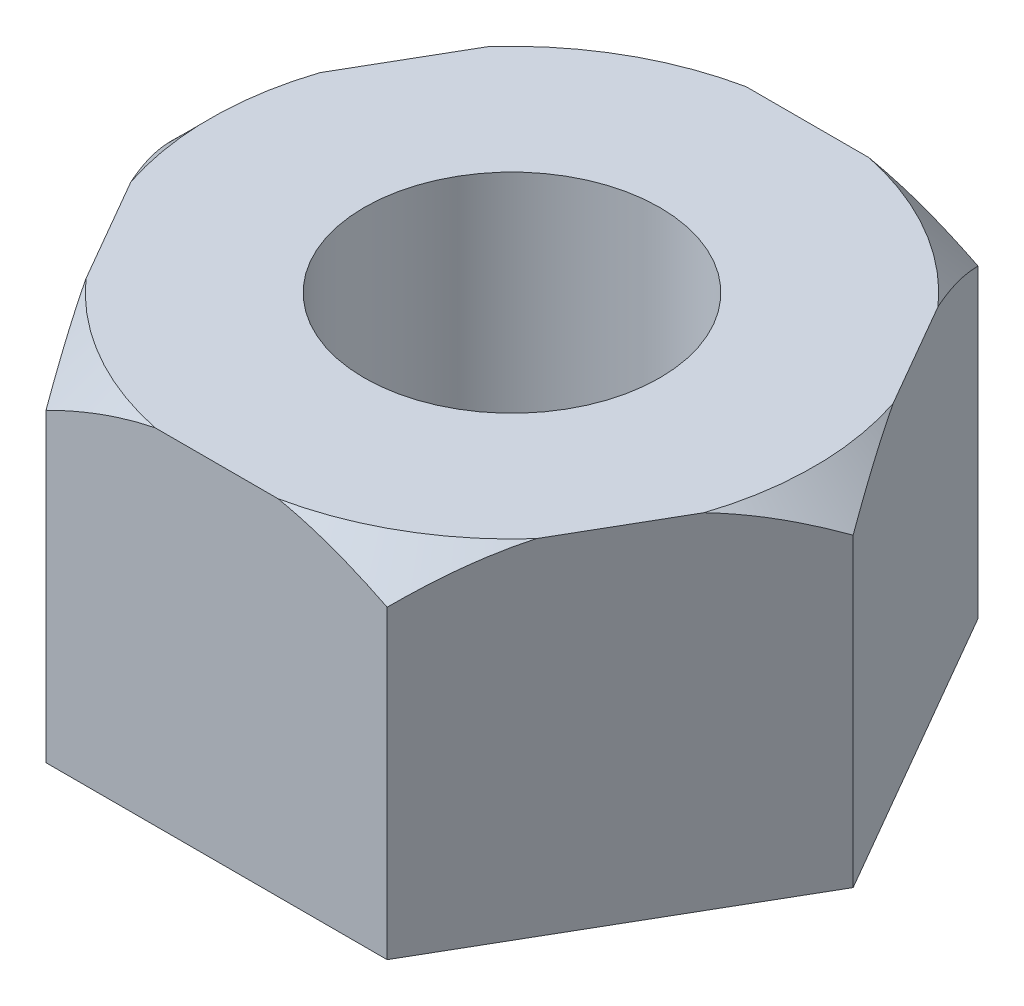
ISO-10303-21;
HEADER;
FILE_DESCRIPTION(('STEP AP214'),'2;1');
FILE_NAME('part.step','',(''),(''),'','','');
FILE_SCHEMA(('AUTOMOTIVE_DESIGN { 1 0 10303 214 1 1 1 1 }'));
ENDSEC;
DATA;
#1=APPLICATION_CONTEXT('core data for automotive mechanical design processes');
#2=APPLICATION_PROTOCOL_DEFINITION('international standard','automotive_design',2000,#1);
#3=PRODUCT_CONTEXT('',#1,'mechanical');
#4=PRODUCT('Part','Part','',(#3));
#5=PRODUCT_RELATED_PRODUCT_CATEGORY('part','',(#4));
#6=PRODUCT_DEFINITION_FORMATION('','',#4);
#7=PRODUCT_DEFINITION_CONTEXT('part definition',#1,'design');
#8=PRODUCT_DEFINITION('design','',#6,#7);
#9=PRODUCT_DEFINITION_SHAPE('','',#8);
#10=(LENGTH_UNIT() NAMED_UNIT(*) SI_UNIT(.MILLI.,.METRE.));
#11=(NAMED_UNIT(*) PLANE_ANGLE_UNIT() SI_UNIT($,.RADIAN.));
#12=(NAMED_UNIT(*) SI_UNIT($,.STERADIAN.) SOLID_ANGLE_UNIT());
#13=UNCERTAINTY_MEASURE_WITH_UNIT(LENGTH_MEASURE(1.E-05),#10,'distance_accuracy_value','');
#14=(GEOMETRIC_REPRESENTATION_CONTEXT(3) GLOBAL_UNCERTAINTY_ASSIGNED_CONTEXT((#13)) GLOBAL_UNIT_ASSIGNED_CONTEXT((#10,
#11,#12)) REPRESENTATION_CONTEXT('',''));
#15=CARTESIAN_POINT('',(0.,0.,0.));
#16=DIRECTION('',(0.,0.,1.));
#17=DIRECTION('',(1.,0.,0.));
#18=AXIS2_PLACEMENT_3D('',#15,#16,#17);
#19=CARTESIAN_POINT('',(0.,35.,30.));
#20=DIRECTION('',(0.,0.,-1.));
#21=DIRECTION('',(-1.,0.,0.));
#22=AXIS2_PLACEMENT_3D('',#19,#20,#21);
#23=PLANE('',#22);
#24=CARTESIAN_POINT('',(-17.3212080756888,30.9996499946957,30.));
#25=CARTESIAN_POINT('',(-16.7256493499404,31.2973869937047,30.));
#26=CARTESIAN_POINT('',(-16.1254263830851,31.5860386847505,30.));
#27=CARTESIAN_POINT('',(-14.9149260558558,32.1422855154077,30.));
#28=CARTESIAN_POINT('',(-14.3046434213451,32.4098691553472,30.));
#29=CARTESIAN_POINT('',(-13.0704193458528,32.9222271765785,30.));
#30=CARTESIAN_POINT('',(-12.4464197055633,33.1668621851123,30.));
#31=CARTESIAN_POINT('',(-11.1881710095387,33.6280095485974,30.));
#32=CARTESIAN_POINT('',(-10.553923537521,33.8445262031392,30.));
#33=CARTESIAN_POINT('',(-9.28542829165949,34.24257128034,30.));
#34=CARTESIAN_POINT('',(-8.65133714521307,34.4245960550511,30.));
#35=CARTESIAN_POINT('',(-7.37416055217103,34.7541627714998,30.));
#36=CARTESIAN_POINT('',(-6.73107466548337,34.9017030196894,30.));
#37=CARTESIAN_POINT('',(-5.43883524211503,35.1585463573618,30.));
#38=CARTESIAN_POINT('',(-4.78969950699842,35.2679384528005,30.));
#39=CARTESIAN_POINT('',(-3.48589667284566,35.4460701737617,30.));
#40=CARTESIAN_POINT('',(-2.83123041520359,35.5148158740064,30.));
#41=CARTESIAN_POINT('',(-1.70551216262249,35.5962300115555,30.));
#42=CARTESIAN_POINT('',(-1.23518927468543,35.6192862050878,30.));
#43=CARTESIAN_POINT('',(-0.293985012674871,35.643262811053,30.));
#44=CARTESIAN_POINT('',(0.176896334323377,35.6441842560093,30.));
#45=CARTESIAN_POINT('',(1.11834411477039,35.6238692770417,30.));
#46=CARTESIAN_POINT('',(1.58891037456097,35.6026249011559,30.));
#47=CARTESIAN_POINT('',(2.52854994936798,35.5382943463951,30.));
#48=CARTESIAN_POINT('',(2.997623238647,35.4952077930119,30.));
#49=CARTESIAN_POINT('',(3.93380497660384,35.3877790136622,30.));
#50=CARTESIAN_POINT('',(4.40091092678331,35.3234151058416,30.));
#51=CARTESIAN_POINT('',(5.3319063711443,35.1743451148509,30.));
#52=CARTESIAN_POINT('',(5.79579549138835,35.089636706224,30.));
#53=CARTESIAN_POINT('',(6.71953441209911,34.9010137997353,30.));
#54=CARTESIAN_POINT('',(7.17938507693756,34.7971035221496,30.));
#55=CARTESIAN_POINT('',(8.09466419122881,34.5713068461951,30.));
#56=CARTESIAN_POINT('',(8.55009228029289,34.4494189957485,30.));
#57=CARTESIAN_POINT('',(9.72262468182692,34.1123843377849,30.));
#58=CARTESIAN_POINT('',(10.4361026144483,33.8845488280805,30.));
#59=CARTESIAN_POINT('',(11.8501685874225,33.3921877247156,30.));
#60=CARTESIAN_POINT('',(12.5507562370119,33.1276610208463,30.));
#61=CARTESIAN_POINT('',(13.9369689818982,32.5677904610197,30.));
#62=CARTESIAN_POINT('',(14.6226333474743,32.2725435188983,30.));
#63=CARTESIAN_POINT('',(15.6416519558882,31.809524532709,30.));
#64=CARTESIAN_POINT('',(15.9796568109956,31.6518712407164,30.));
#65=CARTESIAN_POINT('',(16.652656241667,31.3303231767564,30.));
#66=CARTESIAN_POINT('',(16.9876510329506,31.1664288565404,30.));
#67=CARTESIAN_POINT('',(17.3212080756888,30.9996499946957,30.));
#68=B_SPLINE_CURVE_WITH_KNOTS('',3,(#24,#25,#26,#27,#28,#29,#30,#31,#32,#33,#34,#35,#36,#37,#38,
#39,#40,#41,#42,#43,#44,#45,#46,#47,#48,#49,#50,#51,#52,#53,#54,#55,#56,#57,#58,#59,#60,#61,#62,
#63,#64,#65,#66,#67),.UNSPECIFIED.,.F.,.F.,(4,2,2,2,2,2,2,2,2,2,2,2,2,2,2,2,2,2,2,2,2,4),(0.,
1.99759252033984,3.9962679438711,6.00638729296075,8.01619891096007,9.99442753699228,
11.9727532941786,13.9464319131654,15.9198154855279,17.3319959871297,18.7441106143751,
20.1567320103088,21.5693776280141,22.9834672071165,24.3977184992239,25.8116593294939,
27.2257144286715,29.4713911993988,31.7171359350388,33.9559992463631,35.0748377999485,
36.1935955207465),.UNSPECIFIED.);
#69=CARTESIAN_POINT('',(-17.3205080756888,31.,30.));
#70=VERTEX_POINT('',#69);
#71=CARTESIAN_POINT('',(-6.23473101175829,35.,30.));
#72=VERTEX_POINT('',#71);
#73=EDGE_CURVE('E146',#70,#72,#68,.T.);
#74=ORIENTED_EDGE('',*,*,#73,.F.);
#75=DIRECTION('',(0.,-1.,0.));
#76=VECTOR('',#75,1.);
#77=CARTESIAN_POINT('',(-17.3205080756888,35.,30.));
#78=LINE('',#77,#76);
#79=CARTESIAN_POINT('',(-17.3205080756888,0.,30.));
#80=VERTEX_POINT('',#79);
#81=EDGE_CURVE('E154',#70,#80,#78,.T.);
#82=ORIENTED_EDGE('',*,*,#81,.T.);
#83=DIRECTION('',(1.,0.,0.));
#84=VECTOR('',#83,1.);
#85=CARTESIAN_POINT('',(0.,0.,30.));
#86=LINE('',#85,#84);
#87=CARTESIAN_POINT('',(17.3205080756888,0.,30.));
#88=VERTEX_POINT('',#87);
#89=EDGE_CURVE('E206',#80,#88,#86,.T.);
#90=ORIENTED_EDGE('',*,*,#89,.T.);
#91=DIRECTION('',(0.,-1.,0.));
#92=VECTOR('',#91,1.);
#93=CARTESIAN_POINT('',(17.3205080756888,35.,30.));
#94=LINE('',#93,#92);
#95=CARTESIAN_POINT('',(17.3205080756888,31.,30.));
#96=VERTEX_POINT('',#95);
#97=EDGE_CURVE('E163',#96,#88,#94,.T.);
#98=ORIENTED_EDGE('',*,*,#97,.F.);
#99=CARTESIAN_POINT('',(6.23473101175829,35.,30.));
#100=VERTEX_POINT('',#99);
#101=EDGE_CURVE('E210',#100,#96,#68,.T.);
#102=ORIENTED_EDGE('',*,*,#101,.F.);
#103=DIRECTION('',(1.,0.,0.));
#104=VECTOR('',#103,1.);
#105=CARTESIAN_POINT('',(0.,35.,30.));
#106=LINE('',#105,#104);
#107=EDGE_CURVE('E200',#72,#100,#106,.T.);
#108=ORIENTED_EDGE('',*,*,#107,.F.);
#109=EDGE_LOOP('',(#74,#82,#90,#98,#102,#108));
#110=FACE_BOUND('',#109,.T.);
#111=ADVANCED_FACE('F41',(#110),#23,.F.);
#112=CARTESIAN_POINT('',(25.9807621135332,35.,15.));
#113=DIRECTION('',(-0.866025403784438,0.,-0.5));
#114=DIRECTION('',(-0.5,0.,0.866025403784438));
#115=AXIS2_PLACEMENT_3D('',#112,#113,#114);
#116=PLANE('',#115);
#117=CARTESIAN_POINT('',(17.3201039305003,30.9995958477391,30.0007));
#118=CARTESIAN_POINT('',(17.6178849253997,31.297335873348,29.4849281873058));
#119=CARTESIAN_POINT('',(17.9179980616538,31.5859905539088,28.9651169872949));
#120=CARTESIAN_POINT('',(18.5232515839997,32.1422432530776,27.9167871351318));
#121=CARTESIAN_POINT('',(18.8283946072161,32.4098297718256,27.3882639153458));
#122=CARTESIAN_POINT('',(19.4455101585107,32.922193439786,26.3193884263627));
#123=CARTESIAN_POINT('',(19.7575117871203,33.1668312127839,25.7789857535666));
#124=CARTESIAN_POINT('',(20.3866398206602,33.6279838878028,24.6893040350097));
#125=CARTESIAN_POINT('',(20.7037654337131,33.8445030894911,24.1400263608206));
#126=CARTESIAN_POINT('',(21.3380167815827,34.2425528929339,23.0414708015414));
#127=CARTESIAN_POINT('',(21.6550642003824,34.424579858435,22.4923285637717));
#128=CARTESIAN_POINT('',(22.2936562603918,34.7541506254976,21.3862546705254));
#129=CARTESIAN_POINT('',(22.6152011216545,34.9016927334686,20.8293226339058));
#130=CARTESIAN_POINT('',(23.2613247174827,35.1585393755057,19.7102037379621));
#131=CARTESIAN_POINT('',(23.5858945509468,35.2679329181076,19.1480322957982));
#132=CARTESIAN_POINT('',(24.2377999523164,35.4460670639524,18.0188990188974));
#133=CARTESIAN_POINT('',(24.5651350995057,35.5148137421482,17.4519379128625));
#134=CARTESIAN_POINT('',(25.1279963308966,35.5962289121355,16.4770336624828));
#135=CARTESIAN_POINT('',(25.3631578495186,35.6192854153111,16.0697219642445));
#136=CARTESIAN_POINT('',(25.8337601369575,35.6432626277167,15.2546148922421));
#137=CARTESIAN_POINT('',(26.0692008922362,35.6441843694936,14.8468195419269));
#138=CARTESIAN_POINT('',(26.5399249535028,35.6238699666614,14.0315015514681));
#139=CARTESIAN_POINT('',(26.7752081726632,35.6026258700102,13.6239790617139));
#140=CARTESIAN_POINT('',(27.2450281445047,35.5382958520495,12.8102270000738));
#141=CARTESIAN_POINT('',(27.479564884317,35.4952095562233,12.4039974504774));
#142=CARTESIAN_POINT('',(27.9476559541213,35.3877812662005,11.5932399350071));
#143=CARTESIAN_POINT('',(28.1812090348389,35.3234175896055,11.1887141329399));
#144=CARTESIAN_POINT('',(28.6467069715243,35.1743480334421,10.3824480557824));
#145=CARTESIAN_POINT('',(28.8786516405238,35.0896398284171,9.98070810453044));
#146=CARTESIAN_POINT('',(29.3405213207472,34.901017300581,9.18072635190793));
#147=CARTESIAN_POINT('',(29.5704467641555,34.7971071980425,8.78248380197201));
#148=CARTESIAN_POINT('',(30.0280865442122,34.5713108440166,7.98982845134922));
#149=CARTESIAN_POINT('',(30.2558007006627,34.449423140421,7.5954159627741));
#150=CARTESIAN_POINT('',(30.8420725260438,34.1123857598581,6.57996337416801));
#151=CARTESIAN_POINT('',(31.198816916264,33.8845467359897,5.96206396499139));
#152=CARTESIAN_POINT('',(31.905860557015,33.3921775288324,4.73742845604219));
#153=CARTESIAN_POINT('',(32.2561596120484,33.1276462346791,4.13069269488097));
#154=CARTESIAN_POINT('',(32.9492762465609,32.5677656511115,2.93017946833424));
#155=CARTESIAN_POINT('',(33.2921134615822,32.27251327721,2.33636799319184));
#156=CARTESIAN_POINT('',(33.8016301729804,31.809485657007,1.45385916174473));
#157=CARTESIAN_POINT('',(33.9706350422362,31.6518294100274,1.16113414146714));
#158=CARTESIAN_POINT('',(34.3071395990667,31.330275291674,0.578291152058378));
#159=CARTESIAN_POINT('',(34.4746393945083,31.1663778720799,0.288172996096054));
#160=CARTESIAN_POINT('',(34.641420296566,30.9995958477391,-0.000699999999994835));
#161=B_SPLINE_CURVE_WITH_KNOTS('',3,(#117,#118,#119,#120,#121,#122,#123,#124,#125,#126,#127,
#128,#129,#130,#131,#132,#133,#134,#135,#136,#137,#138,#139,#140,#141,#142,#143,#144,#145,#146,
#147,#148,#149,#150,#151,#152,#153,#154,#155,#156,#157,#158,#159,#160),.UNSPECIFIED.,.F.,.F.,(4,
2,2,2,2,2,2,2,2,2,2,2,2,2,2,2,2,2,2,2,2,4),(0.,1.99760534104605,3.99629360413668,
6.00642607696166,8.01625081354651,9.99449188562443,11.9728300909601,13.9465210437682,
15.9199169403016,17.3320979350903,18.7442130540412,20.1568349465639,21.5694810613807,
22.9835711726471,24.3978229967566,25.8117643596279,27.2258199936692,29.4715309136032,
31.7173098376403,33.9562072983555,35.0750628745769,36.1938376135935),.UNSPECIFIED.);
#162=CARTESIAN_POINT('',(22.863396607654,35.,20.3994354419453));
#163=VERTEX_POINT('',#162);
#164=EDGE_CURVE('E229',#96,#163,#161,.T.);
#165=ORIENTED_EDGE('',*,*,#164,.F.);
#166=ORIENTED_EDGE('',*,*,#97,.T.);
#167=DIRECTION('',(0.5,0.,-0.866025403784438));
#168=VECTOR('',#167,1.);
#169=CARTESIAN_POINT('',(25.9807621135332,0.,15.));
#170=LINE('',#169,#168);
#171=CARTESIAN_POINT('',(34.6410161513776,0.,0.));
#172=VERTEX_POINT('',#171);
#173=EDGE_CURVE('E209',#88,#172,#170,.T.);
#174=ORIENTED_EDGE('',*,*,#173,.T.);
#175=DIRECTION('',(0.,-1.,0.));
#176=VECTOR('',#175,1.);
#177=CARTESIAN_POINT('',(34.6410161513776,35.,0.));
#178=LINE('',#177,#176);
#179=CARTESIAN_POINT('',(34.6410161513776,31.,0.));
#180=VERTEX_POINT('',#179);
#181=EDGE_CURVE('E162',#180,#172,#178,.T.);
#182=ORIENTED_EDGE('',*,*,#181,.F.);
#183=CARTESIAN_POINT('',(29.0981276194123,35.,9.60056455805472));
#184=VERTEX_POINT('',#183);
#185=EDGE_CURVE('E222',#184,#180,#161,.T.);
#186=ORIENTED_EDGE('',*,*,#185,.F.);
#187=DIRECTION('',(0.5,0.,-0.866025403784438));
#188=VECTOR('',#187,1.);
#189=CARTESIAN_POINT('',(25.9807621135332,35.,15.));
#190=LINE('',#189,#188);
#191=EDGE_CURVE('E185',#163,#184,#190,.T.);
#192=ORIENTED_EDGE('',*,*,#191,.F.);
#193=EDGE_LOOP('',(#165,#166,#174,#182,#186,#192));
#194=FACE_BOUND('',#193,.T.);
#195=ADVANCED_FACE('F236',(#194),#116,.F.);
#196=CARTESIAN_POINT('',(25.9807621135332,35.,-15.));
#197=DIRECTION('',(-0.866025403784439,0.,0.5));
#198=DIRECTION('',(0.5,0.,0.866025403784439));
#199=AXIS2_PLACEMENT_3D('',#196,#197,#198);
#200=PLANE('',#199);
#201=CARTESIAN_POINT('',(34.641420296566,30.9995958477391,0.000700000000006301));
#202=CARTESIAN_POINT('',(34.3436393016666,31.297335873348,-0.515071812694158));
#203=CARTESIAN_POINT('',(34.0435261654125,31.5859905539087,-1.03488301270512));
#204=CARTESIAN_POINT('',(33.4382726430666,32.1422432530776,-2.08321286486814));
#205=CARTESIAN_POINT('',(33.1331296198502,32.4098297718256,-2.61173608465415));
#206=CARTESIAN_POINT('',(32.5160140685556,32.9221934397859,-3.68061157363734));
#207=CARTESIAN_POINT('',(32.204012439946,33.1668312127839,-4.22101424643338));
#208=CARTESIAN_POINT('',(31.5748844064061,33.6279838878028,-5.31069596499034));
#209=CARTESIAN_POINT('',(31.2577587933532,33.8445030894911,-5.85997363917939));
#210=CARTESIAN_POINT('',(30.6235074454836,34.2425528929338,-6.95852919845863));
#211=CARTESIAN_POINT('',(30.3064600266839,34.424579858435,-7.50767143622825));
#212=CARTESIAN_POINT('',(29.6678679666745,34.7541506254976,-8.61374532947461));
#213=CARTESIAN_POINT('',(29.3463231054119,34.9016927334685,-9.1706773660942));
#214=CARTESIAN_POINT('',(28.7001995095836,35.1585393755057,-10.2897962620379));
#215=CARTESIAN_POINT('',(28.3756296761195,35.2679329181076,-10.8519677042018));
#216=CARTESIAN_POINT('',(27.7237242747499,35.4460670639524,-11.9811009811026));
#217=CARTESIAN_POINT('',(27.3963891275606,35.5148137421482,-12.5480620871375));
#218=CARTESIAN_POINT('',(26.8335278961698,35.5962289121355,-13.5229663375172));
#219=CARTESIAN_POINT('',(26.5983663775478,35.6192854153111,-13.9302780357555));
#220=CARTESIAN_POINT('',(26.1277640901088,35.6432626277167,-14.7453851077579));
#221=CARTESIAN_POINT('',(25.8923233348301,35.6441843694936,-15.1531804580731));
#222=CARTESIAN_POINT('',(25.4215992735635,35.6238699666614,-15.968498448532));
#223=CARTESIAN_POINT('',(25.1863160544031,35.6026258700102,-16.3760209382861));
#224=CARTESIAN_POINT('',(24.7164960825616,35.5382958520495,-17.1897729999262));
#225=CARTESIAN_POINT('',(24.4819593427493,35.4952095562233,-17.5960025495227));
#226=CARTESIAN_POINT('',(24.0138682729451,35.3877812662005,-18.4067600649929));
#227=CARTESIAN_POINT('',(23.7803151922274,35.3234175896054,-18.8112858670601));
#228=CARTESIAN_POINT('',(23.3148172555421,35.1743480334421,-19.6175519442176));
#229=CARTESIAN_POINT('',(23.0828725865425,35.0896398284171,-20.0192918954696));
#230=CARTESIAN_POINT('',(22.6210029063191,34.901017300581,-20.8192736480921));
#231=CARTESIAN_POINT('',(22.3910774629109,34.7971071980425,-21.217516198028));
#232=CARTESIAN_POINT('',(21.9334376828542,34.5713108440166,-22.0101715486508));
#233=CARTESIAN_POINT('',(21.7057235264036,34.449423140421,-22.4045840372259));
#234=CARTESIAN_POINT('',(21.1194517010226,34.1123857598581,-23.420036625832));
#235=CARTESIAN_POINT('',(20.7627073108023,33.8845467359897,-24.0379360350086));
#236=CARTESIAN_POINT('',(20.0556636700513,33.3921775288324,-25.2625715439578));
#237=CARTESIAN_POINT('',(19.7053646150179,33.1276462346791,-25.869307305119));
#238=CARTESIAN_POINT('',(19.0122479805055,32.5677656511115,-27.0698205316658));
#239=CARTESIAN_POINT('',(18.6694107654841,32.27251327721,-27.6636320068082));
#240=CARTESIAN_POINT('',(18.1598940540859,31.809485657007,-28.5461408382553));
#241=CARTESIAN_POINT('',(17.9908891848301,31.6518294100274,-28.8388658585329));
#242=CARTESIAN_POINT('',(17.6543846279997,31.330275291674,-29.4217088479416));
#243=CARTESIAN_POINT('',(17.486884832558,31.1663778720799,-29.711827003904));
#244=CARTESIAN_POINT('',(17.3201039305004,30.9995958477391,-30.0007));
#245=B_SPLINE_CURVE_WITH_KNOTS('',3,(#201,#202,#203,#204,#205,#206,#207,#208,#209,#210,#211,
#212,#213,#214,#215,#216,#217,#218,#219,#220,#221,#222,#223,#224,#225,#226,#227,#228,#229,#230,
#231,#232,#233,#234,#235,#236,#237,#238,#239,#240,#241,#242,#243,#244),.UNSPECIFIED.,.F.,.F.,(4,
2,2,2,2,2,2,2,2,2,2,2,2,2,2,2,2,2,2,2,2,4),(0.,1.99760534104605,3.99629360413668,
6.00642607696167,8.01625081354652,9.99449188562444,11.9728300909601,13.9465210437682,
15.9199169403016,17.3320979350903,18.7442130540412,20.1568349465639,21.5694810613807,
22.9835711726472,24.3978229967566,25.8117643596279,27.2258199936693,29.4715309136033,
31.7173098376403,33.9562072983555,35.0750628745769,36.1938376135935),.UNSPECIFIED.);
#246=CARTESIAN_POINT('',(29.0981276194123,35.,-9.60056455805472));
#247=VERTEX_POINT('',#246);
#248=EDGE_CURVE('E192',#180,#247,#245,.T.);
#249=ORIENTED_EDGE('',*,*,#248,.F.);
#250=ORIENTED_EDGE('',*,*,#181,.T.);
#251=DIRECTION('',(-0.5,0.,-0.866025403784439));
#252=VECTOR('',#251,1.);
#253=CARTESIAN_POINT('',(25.9807621135332,0.,-15.));
#254=LINE('',#253,#252);
#255=CARTESIAN_POINT('',(17.3205080756888,0.,-30.));
#256=VERTEX_POINT('',#255);
#257=EDGE_CURVE('E212',#172,#256,#254,.T.);
#258=ORIENTED_EDGE('',*,*,#257,.T.);
#259=DIRECTION('',(0.,-1.,0.));
#260=VECTOR('',#259,1.);
#261=CARTESIAN_POINT('',(17.3205080756888,35.,-30.));
#262=LINE('',#261,#260);
#263=CARTESIAN_POINT('',(17.3205080756888,31.,-30.));
#264=VERTEX_POINT('',#263);
#265=EDGE_CURVE('E156',#264,#256,#262,.T.);
#266=ORIENTED_EDGE('',*,*,#265,.F.);
#267=CARTESIAN_POINT('',(22.8633966076541,35.,-20.3994354419453));
#268=VERTEX_POINT('',#267);
#269=EDGE_CURVE('E195',#268,#264,#245,.T.);
#270=ORIENTED_EDGE('',*,*,#269,.F.);
#271=DIRECTION('',(-0.5,0.,-0.866025403784439));
#272=VECTOR('',#271,1.);
#273=CARTESIAN_POINT('',(25.9807621135332,35.,-15.));
#274=LINE('',#273,#272);
#275=EDGE_CURVE('E183',#247,#268,#274,.T.);
#276=ORIENTED_EDGE('',*,*,#275,.F.);
#277=EDGE_LOOP('',(#249,#250,#258,#266,#270,#276));
#278=FACE_BOUND('',#277,.T.);
#279=ADVANCED_FACE('F191',(#278),#200,.F.);
#280=CARTESIAN_POINT('',(0.,35.,-30.));
#281=DIRECTION('',(0.,0.,1.));
#282=DIRECTION('',(1.,0.,0.));
#283=AXIS2_PLACEMENT_3D('',#280,#281,#282);
#284=PLANE('',#283);
#285=CARTESIAN_POINT('',(17.3212080756888,30.9996499946957,-30.));
#286=CARTESIAN_POINT('',(16.7256493499404,31.2973869937047,-30.));
#287=CARTESIAN_POINT('',(16.1254263830851,31.5860386847505,-30.));
#288=CARTESIAN_POINT('',(14.9149260558558,32.1422855154077,-30.));
#289=CARTESIAN_POINT('',(14.3046434213451,32.4098691553472,-30.));
#290=CARTESIAN_POINT('',(13.0704193458528,32.9222271765785,-30.));
#291=CARTESIAN_POINT('',(12.4464197055633,33.1668621851123,-30.));
#292=CARTESIAN_POINT('',(11.1881710095388,33.6280095485974,-30.));
#293=CARTESIAN_POINT('',(10.553923537521,33.8445262031391,-30.));
#294=CARTESIAN_POINT('',(9.2854282916595,34.24257128034,-30.));
#295=CARTESIAN_POINT('',(8.65133714521308,34.4245960550511,-30.));
#296=CARTESIAN_POINT('',(7.37416055217104,34.7541627714998,-30.));
#297=CARTESIAN_POINT('',(6.73107466548338,34.9017030196894,-30.));
#298=CARTESIAN_POINT('',(5.43883524211504,35.1585463573618,-30.));
#299=CARTESIAN_POINT('',(4.78969950699842,35.2679384528005,-30.));
#300=CARTESIAN_POINT('',(3.48589667284566,35.4460701737617,-30.));
#301=CARTESIAN_POINT('',(2.83123041520359,35.5148158740064,-30.));
#302=CARTESIAN_POINT('',(1.70551216262249,35.5962300115555,-30.));
#303=CARTESIAN_POINT('',(1.23518927468543,35.6192862050878,-30.));
#304=CARTESIAN_POINT('',(0.293985012674871,35.643262811053,-30.));
#305=CARTESIAN_POINT('',(-0.176896334323375,35.6441842560092,-30.));
#306=CARTESIAN_POINT('',(-1.11834411477039,35.6238692770417,-30.));
#307=CARTESIAN_POINT('',(-1.58891037456097,35.6026249011559,-30.));
#308=CARTESIAN_POINT('',(-2.52854994936798,35.5382943463951,-30.));
#309=CARTESIAN_POINT('',(-2.997623238647,35.4952077930119,-30.));
#310=CARTESIAN_POINT('',(-3.93380497660384,35.3877790136622,-30.));
#311=CARTESIAN_POINT('',(-4.40091092678332,35.3234151058416,-30.));
#312=CARTESIAN_POINT('',(-5.3319063711443,35.1743451148509,-30.));
#313=CARTESIAN_POINT('',(-5.79579549138835,35.089636706224,-30.));
#314=CARTESIAN_POINT('',(-6.71953441209911,34.9010137997353,-30.));
#315=CARTESIAN_POINT('',(-7.17938507693755,34.7971035221495,-30.));
#316=CARTESIAN_POINT('',(-8.09466419122881,34.5713068461951,-30.));
#317=CARTESIAN_POINT('',(-8.55009228029289,34.4494189957485,-30.));
#318=CARTESIAN_POINT('',(-9.72262468182692,34.1123843377849,-30.));
#319=CARTESIAN_POINT('',(-10.4361026144483,33.8845488280805,-30.));
#320=CARTESIAN_POINT('',(-11.8501685874225,33.3921877247155,-30.));
#321=CARTESIAN_POINT('',(-12.5507562370119,33.1276610208463,-30.));
#322=CARTESIAN_POINT('',(-13.9369689818982,32.5677904610197,-30.));
#323=CARTESIAN_POINT('',(-14.6226333474743,32.2725435188983,-30.));
#324=CARTESIAN_POINT('',(-15.6416519558882,31.809524532709,-30.));
#325=CARTESIAN_POINT('',(-15.9796568109956,31.6518712407164,-30.));
#326=CARTESIAN_POINT('',(-16.652656241667,31.3303231767564,-30.));
#327=CARTESIAN_POINT('',(-16.9876510329506,31.1664288565404,-30.));
#328=CARTESIAN_POINT('',(-17.3212080756888,30.9996499946957,-30.));
#329=B_SPLINE_CURVE_WITH_KNOTS('',3,(#285,#286,#287,#288,#289,#290,#291,#292,#293,#294,#295,
#296,#297,#298,#299,#300,#301,#302,#303,#304,#305,#306,#307,#308,#309,#310,#311,#312,#313,#314,
#315,#316,#317,#318,#319,#320,#321,#322,#323,#324,#325,#326,#327,#328),.UNSPECIFIED.,.F.,.F.,(4,
2,2,2,2,2,2,2,2,2,2,2,2,2,2,2,2,2,2,2,2,4),(0.,1.99759252033984,3.9962679438711,
6.00638729296074,8.01619891096006,9.99442753699227,11.9727532941786,13.9464319131654,
15.9198154855279,17.3319959871297,18.7441106143751,20.1567320103088,21.5693776280141,
22.9834672071165,24.3977184992239,25.8116593294939,27.2257144286715,29.4713911993988,
31.7171359350388,33.9559992463631,35.0748377999485,36.1935955207465),.UNSPECIFIED.);
#330=CARTESIAN_POINT('',(6.23473101175825,35.,-30.));
#331=VERTEX_POINT('',#330);
#332=EDGE_CURVE('E275',#264,#331,#329,.T.);
#333=ORIENTED_EDGE('',*,*,#332,.F.);
#334=ORIENTED_EDGE('',*,*,#265,.T.);
#335=DIRECTION('',(-1.,0.,0.));
#336=VECTOR('',#335,1.);
#337=CARTESIAN_POINT('',(0.,0.,-30.));
#338=LINE('',#337,#336);
#339=CARTESIAN_POINT('',(-17.3205080756888,0.,-30.));
#340=VERTEX_POINT('',#339);
#341=EDGE_CURVE('E215',#256,#340,#338,.T.);
#342=ORIENTED_EDGE('',*,*,#341,.T.);
#343=DIRECTION('',(0.,-1.,0.));
#344=VECTOR('',#343,1.);
#345=CARTESIAN_POINT('',(-17.3205080756888,35.,-30.));
#346=LINE('',#345,#344);
#347=CARTESIAN_POINT('',(-17.3205080756888,31.,-30.));
#348=VERTEX_POINT('',#347);
#349=EDGE_CURVE('E153',#348,#340,#346,.T.);
#350=ORIENTED_EDGE('',*,*,#349,.F.);
#351=CARTESIAN_POINT('',(-6.23473101175825,35.,-30.));
#352=VERTEX_POINT('',#351);
#353=EDGE_CURVE('E269',#352,#348,#329,.T.);
#354=ORIENTED_EDGE('',*,*,#353,.F.);
#355=DIRECTION('',(-1.,0.,0.));
#356=VECTOR('',#355,1.);
#357=CARTESIAN_POINT('',(0.,35.,-30.));
#358=LINE('',#357,#356);
#359=EDGE_CURVE('E196',#331,#352,#358,.T.);
#360=ORIENTED_EDGE('',*,*,#359,.F.);
#361=EDGE_LOOP('',(#333,#334,#342,#350,#354,#360));
#362=FACE_BOUND('',#361,.T.);
#363=ADVANCED_FACE('F276',(#362),#284,.F.);
#364=CARTESIAN_POINT('',(-25.9807621135332,35.,-15.));
#365=DIRECTION('',(0.866025403784439,0.,0.5));
#366=DIRECTION('',(0.5,0.,-0.866025403784439));
#367=AXIS2_PLACEMENT_3D('',#364,#365,#366);
#368=PLANE('',#367);
#369=CARTESIAN_POINT('',(-17.3201039305003,30.9995958477391,-30.0007));
#370=CARTESIAN_POINT('',(-17.6178849253997,31.297335873348,-29.4849281873058));
#371=CARTESIAN_POINT('',(-17.9179980616539,31.5859905539087,-28.9651169872949));
#372=CARTESIAN_POINT('',(-18.5232515839997,32.1422432530776,-27.9167871351319));
#373=CARTESIAN_POINT('',(-18.8283946072161,32.4098297718256,-27.3882639153458));
#374=CARTESIAN_POINT('',(-19.4455101585108,32.9221934397859,-26.3193884263627));
#375=CARTESIAN_POINT('',(-19.7575117871203,33.1668312127839,-25.7789857535666));
#376=CARTESIAN_POINT('',(-20.3866398206602,33.6279838878028,-24.6893040350097));
#377=CARTESIAN_POINT('',(-20.7037654337131,33.8445030894911,-24.1400263608206));
#378=CARTESIAN_POINT('',(-21.3380167815827,34.2425528929339,-23.0414708015414));
#379=CARTESIAN_POINT('',(-21.6550642003824,34.424579858435,-22.4923285637717));
#380=CARTESIAN_POINT('',(-22.2936562603918,34.7541506254976,-21.3862546705254));
#381=CARTESIAN_POINT('',(-22.6152011216545,34.9016927334685,-20.8293226339058));
#382=CARTESIAN_POINT('',(-23.2613247174827,35.1585393755057,-19.7102037379621));
#383=CARTESIAN_POINT('',(-23.5858945509468,35.2679329181076,-19.1480322957982));
#384=CARTESIAN_POINT('',(-24.2377999523164,35.4460670639524,-18.0188990188974));
#385=CARTESIAN_POINT('',(-24.5651350995057,35.5148137421482,-17.4519379128625));
#386=CARTESIAN_POINT('',(-25.1279963308966,35.5962289121355,-16.4770336624828));
#387=CARTESIAN_POINT('',(-25.3631578495185,35.6192854153111,-16.0697219642445));
#388=CARTESIAN_POINT('',(-25.8337601369575,35.6432626277167,-15.2546148922421));
#389=CARTESIAN_POINT('',(-26.0692008922362,35.6441843694936,-14.8468195419269));
#390=CARTESIAN_POINT('',(-26.5399249535028,35.6238699666614,-14.031501551468));
#391=CARTESIAN_POINT('',(-26.7752081726632,35.6026258700102,-13.6239790617139));
#392=CARTESIAN_POINT('',(-27.2450281445047,35.5382958520495,-12.8102270000738));
#393=CARTESIAN_POINT('',(-27.479564884317,35.4952095562233,-12.4039974504773));
#394=CARTESIAN_POINT('',(-27.9476559541213,35.3877812662005,-11.5932399350071));
#395=CARTESIAN_POINT('',(-28.1812090348389,35.3234175896055,-11.1887141329399));
#396=CARTESIAN_POINT('',(-28.6467069715243,35.1743480334421,-10.3824480557824));
#397=CARTESIAN_POINT('',(-28.8786516405238,35.0896398284171,-9.98070810453043));
#398=CARTESIAN_POINT('',(-29.3405213207472,34.901017300581,-9.18072635190792));
#399=CARTESIAN_POINT('',(-29.5704467641555,34.7971071980425,-8.78248380197201));
#400=CARTESIAN_POINT('',(-30.0280865442122,34.5713108440166,-7.98982845134921));
#401=CARTESIAN_POINT('',(-30.2558007006627,34.449423140421,-7.5954159627741));
#402=CARTESIAN_POINT('',(-30.8420725260438,34.1123857598581,-6.579963374168));
#403=CARTESIAN_POINT('',(-31.198816916264,33.8845467359897,-5.96206396499139));
#404=CARTESIAN_POINT('',(-31.905860557015,33.3921775288324,-4.73742845604218));
#405=CARTESIAN_POINT('',(-32.2561596120484,33.1276462346791,-4.13069269488097));
#406=CARTESIAN_POINT('',(-32.9492762465609,32.5677656511115,-2.93017946833423));
#407=CARTESIAN_POINT('',(-33.2921134615822,32.27251327721,-2.33636799319183));
#408=CARTESIAN_POINT('',(-33.8016301729804,31.809485657007,-1.45385916174472));
#409=CARTESIAN_POINT('',(-33.9706350422362,31.6518294100274,-1.16113414146713));
#410=CARTESIAN_POINT('',(-34.3071395990667,31.330275291674,-0.578291152058365));
#411=CARTESIAN_POINT('',(-34.4746393945083,31.1663778720799,-0.288172996096041));
#412=CARTESIAN_POINT('',(-34.641420296566,30.9995958477391,0.00070000000000627));
#413=B_SPLINE_CURVE_WITH_KNOTS('',3,(#369,#370,#371,#372,#373,#374,#375,#376,#377,#378,#379,
#380,#381,#382,#383,#384,#385,#386,#387,#388,#389,#390,#391,#392,#393,#394,#395,#396,#397,#398,
#399,#400,#401,#402,#403,#404,#405,#406,#407,#408,#409,#410,#411,#412),.UNSPECIFIED.,.F.,.F.,(4,
2,2,2,2,2,2,2,2,2,2,2,2,2,2,2,2,2,2,2,2,4),(0.,1.99760534104605,3.99629360413669,
6.00642607696167,8.01625081354651,9.99449188562443,11.9728300909601,13.9465210437682,
15.9199169403016,17.3320979350903,18.7442130540412,20.1568349465639,21.5694810613807,
22.9835711726471,24.3978229967566,25.8117643596279,27.2258199936692,29.4715309136032,
31.7173098376403,33.9562072983555,35.0750628745769,36.1938376135935),.UNSPECIFIED.);
#414=CARTESIAN_POINT('',(-22.863396607654,35.,-20.3994354419453));
#415=VERTEX_POINT('',#414);
#416=EDGE_CURVE('E65',#348,#415,#413,.T.);
#417=ORIENTED_EDGE('',*,*,#416,.F.);
#418=ORIENTED_EDGE('',*,*,#349,.T.);
#419=DIRECTION('',(-0.5,0.,0.866025403784439));
#420=VECTOR('',#419,1.);
#421=CARTESIAN_POINT('',(-25.9807621135332,0.,-15.));
#422=LINE('',#421,#420);
#423=CARTESIAN_POINT('',(-34.6410161513776,0.,0.));
#424=VERTEX_POINT('',#423);
#425=EDGE_CURVE('E151',#340,#424,#422,.T.);
#426=ORIENTED_EDGE('',*,*,#425,.T.);
#427=DIRECTION('',(0.,-1.,0.));
#428=VECTOR('',#427,1.);
#429=CARTESIAN_POINT('',(-34.6410161513776,35.,0.));
#430=LINE('',#429,#428);
#431=CARTESIAN_POINT('',(-34.6410161513776,31.,0.));
#432=VERTEX_POINT('',#431);
#433=EDGE_CURVE('E141',#432,#424,#430,.T.);
#434=ORIENTED_EDGE('',*,*,#433,.F.);
#435=CARTESIAN_POINT('',(-29.0981276194123,35.,-9.60056455805468));
#436=VERTEX_POINT('',#435);
#437=EDGE_CURVE('E129',#436,#432,#413,.T.);
#438=ORIENTED_EDGE('',*,*,#437,.F.);
#439=DIRECTION('',(-0.5,0.,0.866025403784439));
#440=VECTOR('',#439,1.);
#441=CARTESIAN_POINT('',(-25.9807621135332,35.,-15.));
#442=LINE('',#441,#440);
#443=EDGE_CURVE('E198',#415,#436,#442,.T.);
#444=ORIENTED_EDGE('',*,*,#443,.F.);
#445=EDGE_LOOP('',(#417,#418,#426,#434,#438,#444));
#446=FACE_BOUND('',#445,.T.);
#447=ADVANCED_FACE('F149',(#446),#368,.F.);
#448=CARTESIAN_POINT('',(-25.9807621135332,35.,15.));
#449=DIRECTION('',(0.866025403784439,0.,-0.5));
#450=DIRECTION('',(-0.5,0.,-0.866025403784439));
#451=AXIS2_PLACEMENT_3D('',#448,#449,#450);
#452=PLANE('',#451);
#453=CARTESIAN_POINT('',(-34.641420296566,30.9995958477391,-0.000699999999993812));
#454=CARTESIAN_POINT('',(-34.3436393016666,31.297335873348,0.51507181269417));
#455=CARTESIAN_POINT('',(-34.0435261654125,31.5859905539087,1.03488301270513));
#456=CARTESIAN_POINT('',(-33.4382726430666,32.1422432530776,2.08321286486815));
#457=CARTESIAN_POINT('',(-33.1331296198502,32.4098297718256,2.61173608465416));
#458=CARTESIAN_POINT('',(-32.5160140685556,32.9221934397859,3.68061157363735));
#459=CARTESIAN_POINT('',(-32.204012439946,33.1668312127839,4.22101424643339));
#460=CARTESIAN_POINT('',(-31.5748844064061,33.6279838878028,5.31069596499035));
#461=CARTESIAN_POINT('',(-31.2577587933532,33.8445030894911,5.8599736391794));
#462=CARTESIAN_POINT('',(-30.6235074454836,34.2425528929338,6.95852919845864));
#463=CARTESIAN_POINT('',(-30.3064600266839,34.424579858435,7.50767143622826));
#464=CARTESIAN_POINT('',(-29.6678679666745,34.7541506254976,8.61374532947461));
#465=CARTESIAN_POINT('',(-29.3463231054119,34.9016927334685,9.17067736609421));
#466=CARTESIAN_POINT('',(-28.7001995095836,35.1585393755057,10.2897962620379));
#467=CARTESIAN_POINT('',(-28.3756296761195,35.2679329181076,10.8519677042018));
#468=CARTESIAN_POINT('',(-27.7237242747499,35.4460670639524,11.9811009811026));
#469=CARTESIAN_POINT('',(-27.3963891275606,35.5148137421482,12.5480620871375));
#470=CARTESIAN_POINT('',(-26.8335278961698,35.5962289121355,13.5229663375172));
#471=CARTESIAN_POINT('',(-26.5983663775478,35.6192854153111,13.9302780357555));
#472=CARTESIAN_POINT('',(-26.1277640901088,35.6432626277167,14.745385107758));
#473=CARTESIAN_POINT('',(-25.8923233348301,35.6441843694936,15.1531804580731));
#474=CARTESIAN_POINT('',(-25.4215992735635,35.6238699666614,15.968498448532));
#475=CARTESIAN_POINT('',(-25.1863160544031,35.6026258700102,16.3760209382861));
#476=CARTESIAN_POINT('',(-24.7164960825616,35.5382958520495,17.1897729999262));
#477=CARTESIAN_POINT('',(-24.4819593427493,35.4952095562233,17.5960025495227));
#478=CARTESIAN_POINT('',(-24.013868272945,35.3877812662005,18.4067600649929));
#479=CARTESIAN_POINT('',(-23.7803151922274,35.3234175896054,18.8112858670601));
#480=CARTESIAN_POINT('',(-23.3148172555421,35.1743480334421,19.6175519442176));
#481=CARTESIAN_POINT('',(-23.0828725865425,35.0896398284171,20.0192918954696));
#482=CARTESIAN_POINT('',(-22.6210029063191,34.901017300581,20.8192736480921));
#483=CARTESIAN_POINT('',(-22.3910774629108,34.7971071980425,21.217516198028));
#484=CARTESIAN_POINT('',(-21.9334376828542,34.5713108440166,22.0101715486508));
#485=CARTESIAN_POINT('',(-21.7057235264036,34.449423140421,22.4045840372259));
#486=CARTESIAN_POINT('',(-21.1194517010225,34.1123857598581,23.420036625832));
#487=CARTESIAN_POINT('',(-20.7627073108023,33.8845467359897,24.0379360350086));
#488=CARTESIAN_POINT('',(-20.0556636700513,33.3921775288324,25.2625715439578));
#489=CARTESIAN_POINT('',(-19.7053646150179,33.1276462346791,25.869307305119));
#490=CARTESIAN_POINT('',(-19.0122479805055,32.5677656511115,27.0698205316658));
#491=CARTESIAN_POINT('',(-18.6694107654841,32.27251327721,27.6636320068082));
#492=CARTESIAN_POINT('',(-18.1598940540859,31.809485657007,28.5461408382553));
#493=CARTESIAN_POINT('',(-17.9908891848301,31.6518294100274,28.8388658585329));
#494=CARTESIAN_POINT('',(-17.6543846279997,31.330275291674,29.4217088479416));
#495=CARTESIAN_POINT('',(-17.486884832558,31.1663778720799,29.711827003904));
#496=CARTESIAN_POINT('',(-17.3201039305003,30.9995958477391,30.0007));
#497=B_SPLINE_CURVE_WITH_KNOTS('',3,(#453,#454,#455,#456,#457,#458,#459,#460,#461,#462,#463,
#464,#465,#466,#467,#468,#469,#470,#471,#472,#473,#474,#475,#476,#477,#478,#479,#480,#481,#482,
#483,#484,#485,#486,#487,#488,#489,#490,#491,#492,#493,#494,#495,#496),.UNSPECIFIED.,.F.,.F.,(4,
2,2,2,2,2,2,2,2,2,2,2,2,2,2,2,2,2,2,2,2,4),(0.,1.99760534104605,3.99629360413668,
6.00642607696167,8.01625081354651,9.99449188562444,11.9728300909601,13.9465210437682,
15.9199169403016,17.3320979350903,18.7442130540412,20.1568349465639,21.5694810613807,
22.9835711726472,24.3978229967566,25.8117643596279,27.2258199936693,29.4715309136033,
31.7173098376403,33.9562072983555,35.0750628745769,36.1938376135935),.UNSPECIFIED.);
#498=CARTESIAN_POINT('',(-29.0981276194123,35.,9.60056455805474));
#499=VERTEX_POINT('',#498);
#500=EDGE_CURVE('E57',#432,#499,#497,.T.);
#501=ORIENTED_EDGE('',*,*,#500,.F.);
#502=ORIENTED_EDGE('',*,*,#433,.T.);
#503=DIRECTION('',(0.5,0.,0.866025403784439));
#504=VECTOR('',#503,1.);
#505=CARTESIAN_POINT('',(-25.9807621135332,0.,15.));
#506=LINE('',#505,#504);
#507=EDGE_CURVE('E218',#424,#80,#506,.T.);
#508=ORIENTED_EDGE('',*,*,#507,.T.);
#509=ORIENTED_EDGE('',*,*,#81,.F.);
#510=CARTESIAN_POINT('',(-22.8633966076541,35.,20.3994354419453));
#511=VERTEX_POINT('',#510);
#512=EDGE_CURVE('E148',#511,#70,#497,.T.);
#513=ORIENTED_EDGE('',*,*,#512,.F.);
#514=DIRECTION('',(0.5,0.,0.866025403784439));
#515=VECTOR('',#514,1.);
#516=CARTESIAN_POINT('',(-25.9807621135332,35.,15.));
#517=LINE('',#516,#515);
#518=EDGE_CURVE('E145',#499,#511,#517,.T.);
#519=ORIENTED_EDGE('',*,*,#518,.F.);
#520=EDGE_LOOP('',(#501,#502,#508,#509,#513,#519));
#521=FACE_BOUND('',#520,.T.);
#522=ADVANCED_FACE('F139',(#521),#452,.F.);
#523=CARTESIAN_POINT('',(0.,35.,0.));
#524=DIRECTION('',(0.,1.,0.));
#525=DIRECTION('',(0.,0.,1.));
#526=AXIS2_PLACEMENT_3D('',#523,#524,#525);
#527=PLANE('',#526);
#528=CARTESIAN_POINT('',(0.,35.,0.));
#529=DIRECTION('',(0.,-1.,0.));
#530=DIRECTION('',(0.,0.,-1.));
#531=AXIS2_PLACEMENT_3D('',#528,#529,#530);
#532=CIRCLE('',#531,15.);
#533=CARTESIAN_POINT('',(0.,35.,-15.));
#534=VERTEX_POINT('',#533);
#535=EDGE_CURVE('E293',#534,#534,#532,.T.);
#536=ORIENTED_EDGE('',*,*,#535,.T.);
#537=EDGE_LOOP('',(#536));
#538=FACE_BOUND('',#537,.T.);
#539=ORIENTED_EDGE('',*,*,#107,.T.);
#540=CARTESIAN_POINT('',(0.,35.,0.));
#541=DIRECTION('',(0.,1.,0.));
#542=DIRECTION('',(0.,0.,1.));
#543=AXIS2_PLACEMENT_3D('',#540,#541,#542);
#544=CIRCLE('',#543,30.6410161513776);
#545=EDGE_CURVE('E11',#100,#163,#544,.T.);
#546=ORIENTED_EDGE('',*,*,#545,.T.);
#547=ORIENTED_EDGE('',*,*,#191,.T.);
#548=EDGE_CURVE('E50',#184,#247,#544,.T.);
#549=ORIENTED_EDGE('',*,*,#548,.T.);
#550=ORIENTED_EDGE('',*,*,#275,.T.);
#551=EDGE_CURVE('E174',#268,#331,#544,.T.);
#552=ORIENTED_EDGE('',*,*,#551,.T.);
#553=ORIENTED_EDGE('',*,*,#359,.T.);
#554=EDGE_CURVE('E173',#352,#415,#544,.T.);
#555=ORIENTED_EDGE('',*,*,#554,.T.);
#556=ORIENTED_EDGE('',*,*,#443,.T.);
#557=EDGE_CURVE('E131',#436,#499,#544,.T.);
#558=ORIENTED_EDGE('',*,*,#557,.T.);
#559=ORIENTED_EDGE('',*,*,#518,.T.);
#560=EDGE_CURVE('E45',#511,#72,#544,.T.);
#561=ORIENTED_EDGE('',*,*,#560,.T.);
#562=EDGE_LOOP('',(#539,#546,#547,#549,#550,#552,#553,#555,#556,#558,#559,#561));
#563=FACE_BOUND('',#562,.T.);
#564=ADVANCED_FACE('F182',(#538,#563),#527,.T.);
#565=CARTESIAN_POINT('',(0.,0.,0.));
#566=DIRECTION('',(0.,1.,0.));
#567=DIRECTION('',(0.,0.,1.));
#568=AXIS2_PLACEMENT_3D('',#565,#566,#567);
#569=PLANE('',#568);
#570=CARTESIAN_POINT('',(0.,0.,0.));
#571=DIRECTION('',(0.,-1.,0.));
#572=DIRECTION('',(0.,0.,-1.));
#573=AXIS2_PLACEMENT_3D('',#570,#571,#572);
#574=CIRCLE('',#573,15.);
#575=CARTESIAN_POINT('',(0.,0.,-15.));
#576=VERTEX_POINT('',#575);
#577=EDGE_CURVE('E295',#576,#576,#574,.T.);
#578=ORIENTED_EDGE('',*,*,#577,.F.);
#579=EDGE_LOOP('',(#578));
#580=FACE_BOUND('',#579,.T.);
#581=ORIENTED_EDGE('',*,*,#89,.F.);
#582=ORIENTED_EDGE('',*,*,#507,.F.);
#583=ORIENTED_EDGE('',*,*,#425,.F.);
#584=ORIENTED_EDGE('',*,*,#341,.F.);
#585=ORIENTED_EDGE('',*,*,#257,.F.);
#586=ORIENTED_EDGE('',*,*,#173,.F.);
#587=EDGE_LOOP('',(#581,#582,#583,#584,#585,#586));
#588=FACE_BOUND('',#587,.T.);
#589=ADVANCED_FACE('F303',(#580,#588),#569,.F.);
#590=CARTESIAN_POINT('',(0.,35.,0.));
#591=DIRECTION('',(0.,-1.,0.));
#592=DIRECTION('',(1.,0.,0.));
#593=AXIS2_PLACEMENT_3D('',#590,#591,#592);
#594=CONICAL_SURFACE('',#593,30.6410161513776,0.785398163397448);
#595=ORIENTED_EDGE('',*,*,#73,.T.);
#596=ORIENTED_EDGE('',*,*,#560,.F.);
#597=ORIENTED_EDGE('',*,*,#512,.T.);
#598=EDGE_LOOP('',(#595,#596,#597));
#599=FACE_BOUND('',#598,.T.);
#600=ADVANCED_FACE('F246',(#599),#594,.T.);
#601=ORIENTED_EDGE('',*,*,#437,.T.);
#602=ORIENTED_EDGE('',*,*,#500,.T.);
#603=ORIENTED_EDGE('',*,*,#557,.F.);
#604=EDGE_LOOP('',(#601,#602,#603));
#605=FACE_BOUND('',#604,.T.);
#606=ADVANCED_FACE('F130',(#605),#594,.T.);
#607=ORIENTED_EDGE('',*,*,#353,.T.);
#608=ORIENTED_EDGE('',*,*,#416,.T.);
#609=ORIENTED_EDGE('',*,*,#554,.F.);
#610=EDGE_LOOP('',(#607,#608,#609));
#611=FACE_BOUND('',#610,.T.);
#612=ADVANCED_FACE('F313',(#611),#594,.T.);
#613=ORIENTED_EDGE('',*,*,#269,.T.);
#614=ORIENTED_EDGE('',*,*,#332,.T.);
#615=ORIENTED_EDGE('',*,*,#551,.F.);
#616=EDGE_LOOP('',(#613,#614,#615));
#617=FACE_BOUND('',#616,.T.);
#618=ADVANCED_FACE('F309',(#617),#594,.T.);
#619=ORIENTED_EDGE('',*,*,#185,.T.);
#620=ORIENTED_EDGE('',*,*,#248,.T.);
#621=ORIENTED_EDGE('',*,*,#548,.F.);
#622=EDGE_LOOP('',(#619,#620,#621));
#623=FACE_BOUND('',#622,.T.);
#624=ADVANCED_FACE('F244',(#623),#594,.T.);
#625=ORIENTED_EDGE('',*,*,#101,.T.);
#626=ORIENTED_EDGE('',*,*,#164,.T.);
#627=ORIENTED_EDGE('',*,*,#545,.F.);
#628=EDGE_LOOP('',(#625,#626,#627));
#629=FACE_BOUND('',#628,.T.);
#630=ADVANCED_FACE('F238',(#629),#594,.T.);
#631=CARTESIAN_POINT('',(0.,35.,0.));
#632=DIRECTION('',(0.,-1.,0.));
#633=DIRECTION('',(0.,0.,-1.));
#634=AXIS2_PLACEMENT_3D('',#631,#632,#633);
#635=CYLINDRICAL_SURFACE('',#634,15.);
#636=ORIENTED_EDGE('',*,*,#535,.F.);
#637=EDGE_LOOP('',(#636));
#638=FACE_BOUND('',#637,.T.);
#639=ORIENTED_EDGE('',*,*,#577,.T.);
#640=EDGE_LOOP('',(#639));
#641=FACE_BOUND('',#640,.T.);
#642=ADVANCED_FACE('F243',(#638,#641),#635,.F.);
#643=CLOSED_SHELL('',(#111,#195,#279,#363,#447,#522,#564,#589,#600,#606,#612,#618,#624,#630,#642));
#644=MANIFOLD_SOLID_BREP('B2',#643);
#645=ADVANCED_BREP_SHAPE_REPRESENTATION('',(#18,#644),#14);
#646=SHAPE_DEFINITION_REPRESENTATION(#9,#645);
ENDSEC;
END-ISO-10303-21;
